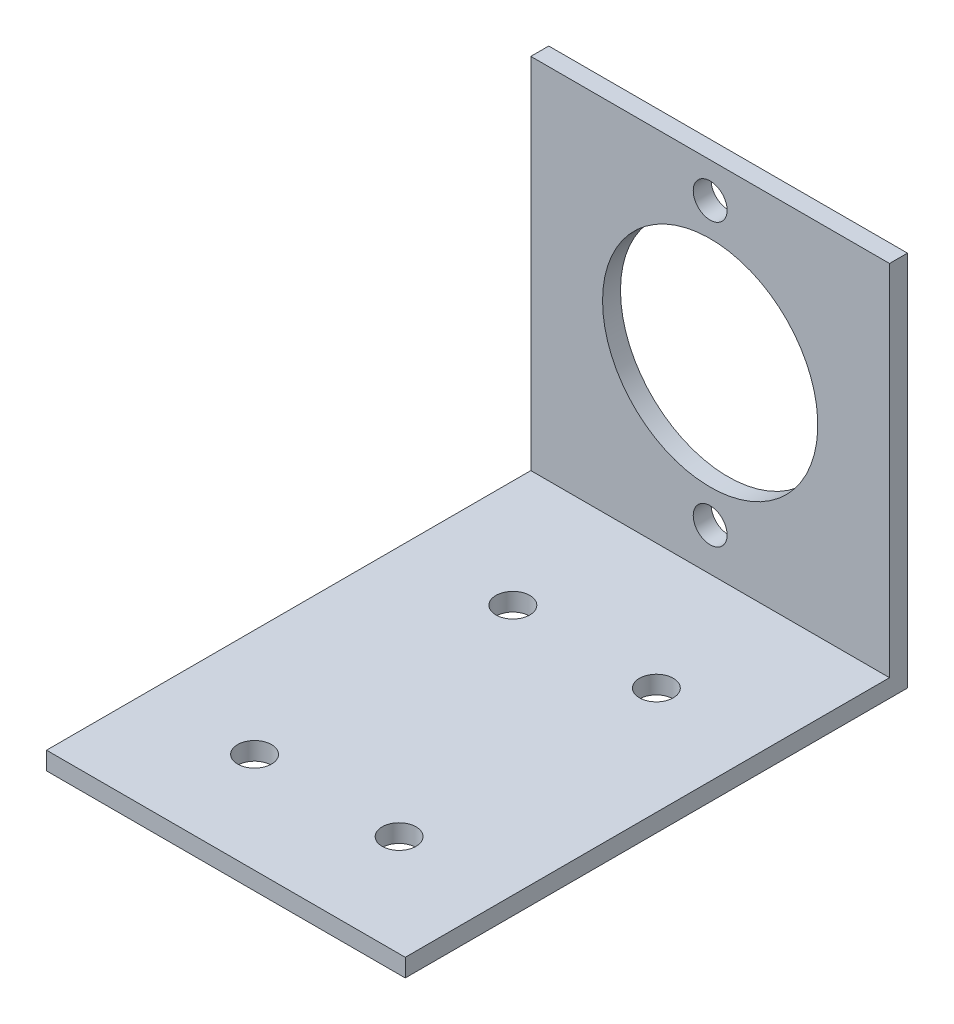
ISO-10303-21;
HEADER;
FILE_DESCRIPTION(('STEP AP214'),'2;1');
FILE_NAME('part.step','',(''),(''),'','','');
FILE_SCHEMA(('AUTOMOTIVE_DESIGN { 1 0 10303 214 1 1 1 1 }'));
ENDSEC;
DATA;
#1=APPLICATION_CONTEXT('core data for automotive mechanical design processes');
#2=APPLICATION_PROTOCOL_DEFINITION('international standard','automotive_design',2000,#1);
#3=PRODUCT_CONTEXT('',#1,'mechanical');
#4=PRODUCT('Part','Part','',(#3));
#5=PRODUCT_RELATED_PRODUCT_CATEGORY('part','',(#4));
#6=PRODUCT_DEFINITION_FORMATION('','',#4);
#7=PRODUCT_DEFINITION_CONTEXT('part definition',#1,'design');
#8=PRODUCT_DEFINITION('design','',#6,#7);
#9=PRODUCT_DEFINITION_SHAPE('','',#8);
#10=(LENGTH_UNIT() NAMED_UNIT(*) SI_UNIT(.MILLI.,.METRE.));
#11=(NAMED_UNIT(*) PLANE_ANGLE_UNIT() SI_UNIT($,.RADIAN.));
#12=(NAMED_UNIT(*) SI_UNIT($,.STERADIAN.) SOLID_ANGLE_UNIT());
#13=UNCERTAINTY_MEASURE_WITH_UNIT(LENGTH_MEASURE(1.E-05),#10,'distance_accuracy_value','');
#14=(GEOMETRIC_REPRESENTATION_CONTEXT(3) GLOBAL_UNCERTAINTY_ASSIGNED_CONTEXT((#13)) GLOBAL_UNIT_ASSIGNED_CONTEXT((#10,
#11,#12)) REPRESENTATION_CONTEXT('',''));
#15=CARTESIAN_POINT('',(0.,0.,0.));
#16=DIRECTION('',(0.,0.,1.));
#17=DIRECTION('',(1.,0.,0.));
#18=AXIS2_PLACEMENT_3D('',#15,#16,#17);
#19=CARTESIAN_POINT('',(0.,1.5875,44.45));
#20=DIRECTION('',(0.,-1.,0.));
#21=DIRECTION('',(0.,0.,-1.));
#22=AXIS2_PLACEMENT_3D('',#19,#20,#21);
#23=PLANE('',#22);
#24=CARTESIAN_POINT('',(22.225,1.5875,12.7));
#25=DIRECTION('',(0.,1.,0.));
#26=DIRECTION('',(0.,0.,1.));
#27=AXIS2_PLACEMENT_3D('',#24,#25,#26);
#28=CIRCLE('',#27,1.49999999999999);
#29=CARTESIAN_POINT('',(22.225,1.5875,14.2));
#30=VERTEX_POINT('',#29);
#31=EDGE_CURVE('E193',#30,#30,#28,.T.);
#32=ORIENTED_EDGE('',*,*,#31,.F.);
#33=EDGE_LOOP('',(#32));
#34=FACE_BOUND('',#33,.T.);
#35=CARTESIAN_POINT('',(22.225,1.5875,35.4699303706849));
#36=DIRECTION('',(0.,1.,0.));
#37=DIRECTION('',(0.,0.,1.));
#38=AXIS2_PLACEMENT_3D('',#35,#36,#37);
#39=CIRCLE('',#38,1.49999999999999);
#40=CARTESIAN_POINT('',(22.225,1.5875,36.9699303706849));
#41=VERTEX_POINT('',#40);
#42=EDGE_CURVE('E180',#41,#41,#39,.T.);
#43=ORIENTED_EDGE('',*,*,#42,.F.);
#44=EDGE_LOOP('',(#43));
#45=FACE_BOUND('',#44,.T.);
#46=CARTESIAN_POINT('',(9.525,1.5875,12.7));
#47=DIRECTION('',(0.,1.,0.));
#48=DIRECTION('',(0.,0.,1.));
#49=AXIS2_PLACEMENT_3D('',#46,#47,#48);
#50=CIRCLE('',#49,1.49999999999999);
#51=CARTESIAN_POINT('',(9.525,1.5875,14.2));
#52=VERTEX_POINT('',#51);
#53=EDGE_CURVE('E176',#52,#52,#50,.T.);
#54=ORIENTED_EDGE('',*,*,#53,.F.);
#55=EDGE_LOOP('',(#54));
#56=FACE_BOUND('',#55,.T.);
#57=CARTESIAN_POINT('',(9.525,1.5875,35.56));
#58=DIRECTION('',(0.,1.,0.));
#59=DIRECTION('',(0.,0.,1.));
#60=AXIS2_PLACEMENT_3D('',#57,#58,#59);
#61=CIRCLE('',#60,1.49999999999999);
#62=CARTESIAN_POINT('',(9.525,1.5875,37.06));
#63=VERTEX_POINT('',#62);
#64=EDGE_CURVE('E175',#63,#63,#61,.T.);
#65=ORIENTED_EDGE('',*,*,#64,.F.);
#66=EDGE_LOOP('',(#65));
#67=FACE_BOUND('',#66,.T.);
#68=DIRECTION('',(1.,0.,0.));
#69=VECTOR('',#68,1.);
#70=CARTESIAN_POINT('',(0.,1.5875,1.5875));
#71=LINE('',#70,#69);
#72=CARTESIAN_POINT('',(0.,1.5875,1.5875));
#73=VERTEX_POINT('',#72);
#74=CARTESIAN_POINT('',(31.75,1.5875,1.5875));
#75=VERTEX_POINT('',#74);
#76=EDGE_CURVE('E57',#73,#75,#71,.T.);
#77=ORIENTED_EDGE('',*,*,#76,.F.);
#78=DIRECTION('',(0.,0.,-1.));
#79=VECTOR('',#78,1.);
#80=CARTESIAN_POINT('',(0.,1.5875,44.45));
#81=LINE('',#80,#79);
#82=CARTESIAN_POINT('',(0.,1.5875,44.45));
#83=VERTEX_POINT('',#82);
#84=EDGE_CURVE('E125',#83,#73,#81,.T.);
#85=ORIENTED_EDGE('',*,*,#84,.F.);
#86=DIRECTION('',(-1.,0.,0.));
#87=VECTOR('',#86,1.);
#88=CARTESIAN_POINT('',(0.,1.5875,44.45));
#89=LINE('',#88,#87);
#90=CARTESIAN_POINT('',(31.75,1.5875,44.45));
#91=VERTEX_POINT('',#90);
#92=EDGE_CURVE('E66',#91,#83,#89,.T.);
#93=ORIENTED_EDGE('',*,*,#92,.F.);
#94=DIRECTION('',(0.,0.,-1.));
#95=VECTOR('',#94,1.);
#96=CARTESIAN_POINT('',(31.75,1.5875,44.45));
#97=LINE('',#96,#95);
#98=EDGE_CURVE('E152',#91,#75,#97,.T.);
#99=ORIENTED_EDGE('',*,*,#98,.T.);
#100=EDGE_LOOP('',(#77,#85,#93,#99));
#101=FACE_BOUND('',#100,.T.);
#102=ADVANCED_FACE('F39',(#34,#45,#56,#67,#101),#23,.F.);
#103=CARTESIAN_POINT('',(0.,0.,44.45));
#104=DIRECTION('',(1.,0.,0.));
#105=DIRECTION('',(0.,0.,-1.));
#106=AXIS2_PLACEMENT_3D('',#103,#104,#105);
#107=PLANE('',#106);
#108=DIRECTION('',(0.,-1.,0.));
#109=VECTOR('',#108,1.);
#110=CARTESIAN_POINT('',(0.,0.,0.));
#111=LINE('',#110,#109);
#112=CARTESIAN_POINT('',(0.,33.3375,0.));
#113=VERTEX_POINT('',#112);
#114=CARTESIAN_POINT('',(0.,0.,0.));
#115=VERTEX_POINT('',#114);
#116=EDGE_CURVE('E127',#113,#115,#111,.T.);
#117=ORIENTED_EDGE('',*,*,#116,.T.);
#118=DIRECTION('',(0.,0.,-1.));
#119=VECTOR('',#118,1.);
#120=CARTESIAN_POINT('',(0.,0.,44.45));
#121=LINE('',#120,#119);
#122=CARTESIAN_POINT('',(0.,0.,44.45));
#123=VERTEX_POINT('',#122);
#124=EDGE_CURVE('E11',#123,#115,#121,.T.);
#125=ORIENTED_EDGE('',*,*,#124,.F.);
#126=DIRECTION('',(0.,-1.,0.));
#127=VECTOR('',#126,1.);
#128=CARTESIAN_POINT('',(0.,0.,44.45));
#129=LINE('',#128,#127);
#130=EDGE_CURVE('E135',#83,#123,#129,.T.);
#131=ORIENTED_EDGE('',*,*,#130,.F.);
#132=ORIENTED_EDGE('',*,*,#84,.T.);
#133=DIRECTION('',(0.,-1.,0.));
#134=VECTOR('',#133,1.);
#135=CARTESIAN_POINT('',(0.,33.3375,1.5875));
#136=LINE('',#135,#134);
#137=CARTESIAN_POINT('',(0.,33.3375,1.5875));
#138=VERTEX_POINT('',#137);
#139=EDGE_CURVE('E105',#138,#73,#136,.T.);
#140=ORIENTED_EDGE('',*,*,#139,.F.);
#141=DIRECTION('',(0.,0.,1.));
#142=VECTOR('',#141,1.);
#143=CARTESIAN_POINT('',(0.,33.3375,0.));
#144=LINE('',#143,#142);
#145=EDGE_CURVE('E113',#113,#138,#144,.T.);
#146=ORIENTED_EDGE('',*,*,#145,.F.);
#147=EDGE_LOOP('',(#117,#125,#131,#132,#140,#146));
#148=FACE_BOUND('',#147,.T.);
#149=ADVANCED_FACE('F41',(#148),#107,.F.);
#150=CARTESIAN_POINT('',(0.,0.,44.45));
#151=DIRECTION('',(0.,1.,0.));
#152=DIRECTION('',(0.,0.,1.));
#153=AXIS2_PLACEMENT_3D('',#150,#151,#152);
#154=PLANE('',#153);
#155=CARTESIAN_POINT('',(22.225,0.,12.7));
#156=DIRECTION('',(0.,1.,0.));
#157=DIRECTION('',(0.,0.,1.));
#158=AXIS2_PLACEMENT_3D('',#155,#156,#157);
#159=CIRCLE('',#158,1.49999999999999);
#160=CARTESIAN_POINT('',(22.225,0.,14.2));
#161=VERTEX_POINT('',#160);
#162=EDGE_CURVE('E43',#161,#161,#159,.T.);
#163=ORIENTED_EDGE('',*,*,#162,.T.);
#164=EDGE_LOOP('',(#163));
#165=FACE_BOUND('',#164,.T.);
#166=CARTESIAN_POINT('',(22.225,0.,35.4699303706849));
#167=DIRECTION('',(0.,1.,0.));
#168=DIRECTION('',(0.,0.,1.));
#169=AXIS2_PLACEMENT_3D('',#166,#167,#168);
#170=CIRCLE('',#169,1.49999999999999);
#171=CARTESIAN_POINT('',(22.225,0.,36.9699303706849));
#172=VERTEX_POINT('',#171);
#173=EDGE_CURVE('E177',#172,#172,#170,.T.);
#174=ORIENTED_EDGE('',*,*,#173,.T.);
#175=EDGE_LOOP('',(#174));
#176=FACE_BOUND('',#175,.T.);
#177=CARTESIAN_POINT('',(9.525,0.,12.7));
#178=DIRECTION('',(0.,1.,0.));
#179=DIRECTION('',(0.,0.,1.));
#180=AXIS2_PLACEMENT_3D('',#177,#178,#179);
#181=CIRCLE('',#180,1.49999999999999);
#182=CARTESIAN_POINT('',(9.525,0.,14.2));
#183=VERTEX_POINT('',#182);
#184=EDGE_CURVE('E172',#183,#183,#181,.T.);
#185=ORIENTED_EDGE('',*,*,#184,.T.);
#186=EDGE_LOOP('',(#185));
#187=FACE_BOUND('',#186,.T.);
#188=CARTESIAN_POINT('',(9.525,0.,35.56));
#189=DIRECTION('',(0.,1.,0.));
#190=DIRECTION('',(0.,0.,1.));
#191=AXIS2_PLACEMENT_3D('',#188,#189,#190);
#192=CIRCLE('',#191,1.49999999999999);
#193=CARTESIAN_POINT('',(9.525,0.,37.06));
#194=VERTEX_POINT('',#193);
#195=EDGE_CURVE('E199',#194,#194,#192,.T.);
#196=ORIENTED_EDGE('',*,*,#195,.T.);
#197=EDGE_LOOP('',(#196));
#198=FACE_BOUND('',#197,.T.);
#199=DIRECTION('',(1.,0.,0.));
#200=VECTOR('',#199,1.);
#201=CARTESIAN_POINT('',(0.,0.,0.));
#202=LINE('',#201,#200);
#203=CARTESIAN_POINT('',(31.75,0.,0.));
#204=VERTEX_POINT('',#203);
#205=EDGE_CURVE('E79',#115,#204,#202,.T.);
#206=ORIENTED_EDGE('',*,*,#205,.T.);
#207=DIRECTION('',(0.,0.,-1.));
#208=VECTOR('',#207,1.);
#209=CARTESIAN_POINT('',(31.75,0.,44.45));
#210=LINE('',#209,#208);
#211=CARTESIAN_POINT('',(31.75,0.,44.45));
#212=VERTEX_POINT('',#211);
#213=EDGE_CURVE('E49',#212,#204,#210,.T.);
#214=ORIENTED_EDGE('',*,*,#213,.F.);
#215=DIRECTION('',(1.,0.,0.));
#216=VECTOR('',#215,1.);
#217=CARTESIAN_POINT('',(0.,0.,44.45));
#218=LINE('',#217,#216);
#219=EDGE_CURVE('E84',#123,#212,#218,.T.);
#220=ORIENTED_EDGE('',*,*,#219,.F.);
#221=ORIENTED_EDGE('',*,*,#124,.T.);
#222=EDGE_LOOP('',(#206,#214,#220,#221));
#223=FACE_BOUND('',#222,.T.);
#224=ADVANCED_FACE('F224',(#165,#176,#187,#198,#223),#154,.F.);
#225=CARTESIAN_POINT('',(31.75,0.,44.45));
#226=DIRECTION('',(-1.,0.,0.));
#227=DIRECTION('',(0.,0.,1.));
#228=AXIS2_PLACEMENT_3D('',#225,#226,#227);
#229=PLANE('',#228);
#230=DIRECTION('',(0.,1.,0.));
#231=VECTOR('',#230,1.);
#232=CARTESIAN_POINT('',(31.75,0.,0.));
#233=LINE('',#232,#231);
#234=CARTESIAN_POINT('',(31.75,33.3375,0.));
#235=VERTEX_POINT('',#234);
#236=EDGE_CURVE('E138',#204,#235,#233,.T.);
#237=ORIENTED_EDGE('',*,*,#236,.T.);
#238=DIRECTION('',(0.,0.,-1.));
#239=VECTOR('',#238,1.);
#240=CARTESIAN_POINT('',(31.75,33.3375,0.));
#241=LINE('',#240,#239);
#242=CARTESIAN_POINT('',(31.75,33.3375,1.5875));
#243=VERTEX_POINT('',#242);
#244=EDGE_CURVE('E112',#243,#235,#241,.T.);
#245=ORIENTED_EDGE('',*,*,#244,.F.);
#246=DIRECTION('',(0.,-1.,0.));
#247=VECTOR('',#246,1.);
#248=CARTESIAN_POINT('',(31.75,33.3375,1.5875));
#249=LINE('',#248,#247);
#250=EDGE_CURVE('E107',#243,#75,#249,.T.);
#251=ORIENTED_EDGE('',*,*,#250,.T.);
#252=ORIENTED_EDGE('',*,*,#98,.F.);
#253=DIRECTION('',(0.,1.,0.));
#254=VECTOR('',#253,1.);
#255=CARTESIAN_POINT('',(31.75,0.,44.45));
#256=LINE('',#255,#254);
#257=EDGE_CURVE('E141',#212,#91,#256,.T.);
#258=ORIENTED_EDGE('',*,*,#257,.F.);
#259=ORIENTED_EDGE('',*,*,#213,.T.);
#260=EDGE_LOOP('',(#237,#245,#251,#252,#258,#259));
#261=FACE_BOUND('',#260,.T.);
#262=ADVANCED_FACE('F218',(#261),#229,.F.);
#263=CARTESIAN_POINT('',(0.,0.,44.45));
#264=DIRECTION('',(0.,0.,-1.));
#265=DIRECTION('',(-1.,0.,0.));
#266=AXIS2_PLACEMENT_3D('',#263,#264,#265);
#267=PLANE('',#266);
#268=ORIENTED_EDGE('',*,*,#130,.T.);
#269=ORIENTED_EDGE('',*,*,#219,.T.);
#270=ORIENTED_EDGE('',*,*,#257,.T.);
#271=ORIENTED_EDGE('',*,*,#92,.T.);
#272=EDGE_LOOP('',(#268,#269,#270,#271));
#273=FACE_BOUND('',#272,.T.);
#274=ADVANCED_FACE('F231',(#273),#267,.F.);
#275=CARTESIAN_POINT('',(0.,0.,0.));
#276=DIRECTION('',(0.,0.,-1.));
#277=DIRECTION('',(-1.,0.,0.));
#278=AXIS2_PLACEMENT_3D('',#275,#276,#277);
#279=PLANE('',#278);
#280=CARTESIAN_POINT('',(15.875,30.226,0.));
#281=DIRECTION('',(0.,0.,-1.));
#282=DIRECTION('',(-1.,0.,0.));
#283=AXIS2_PLACEMENT_3D('',#280,#281,#282);
#284=CIRCLE('',#283,1.5);
#285=CARTESIAN_POINT('',(14.375,30.226,0.));
#286=VERTEX_POINT('',#285);
#287=EDGE_CURVE('E171',#286,#286,#284,.T.);
#288=ORIENTED_EDGE('',*,*,#287,.F.);
#289=EDGE_LOOP('',(#288));
#290=FACE_BOUND('',#289,.T.);
#291=CARTESIAN_POINT('',(15.875,5.334,0.));
#292=DIRECTION('',(0.,0.,-1.));
#293=DIRECTION('',(-1.,0.,0.));
#294=AXIS2_PLACEMENT_3D('',#291,#292,#293);
#295=CIRCLE('',#294,1.5);
#296=CARTESIAN_POINT('',(14.375,5.334,0.));
#297=VERTEX_POINT('',#296);
#298=EDGE_CURVE('E166',#297,#297,#295,.T.);
#299=ORIENTED_EDGE('',*,*,#298,.F.);
#300=EDGE_LOOP('',(#299));
#301=FACE_BOUND('',#300,.T.);
#302=CARTESIAN_POINT('',(15.875,17.78,0.));
#303=DIRECTION('',(0.,0.,-1.));
#304=DIRECTION('',(-1.,0.,0.));
#305=AXIS2_PLACEMENT_3D('',#302,#303,#304);
#306=CIRCLE('',#305,9.525);
#307=CARTESIAN_POINT('',(6.35,17.78,0.));
#308=VERTEX_POINT('',#307);
#309=EDGE_CURVE('E161',#308,#308,#306,.T.);
#310=ORIENTED_EDGE('',*,*,#309,.F.);
#311=EDGE_LOOP('',(#310));
#312=FACE_BOUND('',#311,.T.);
#313=ORIENTED_EDGE('',*,*,#116,.F.);
#314=DIRECTION('',(-1.,0.,0.));
#315=VECTOR('',#314,1.);
#316=CARTESIAN_POINT('',(0.,33.3375,0.));
#317=LINE('',#316,#315);
#318=EDGE_CURVE('E119',#235,#113,#317,.T.);
#319=ORIENTED_EDGE('',*,*,#318,.F.);
#320=ORIENTED_EDGE('',*,*,#236,.F.);
#321=ORIENTED_EDGE('',*,*,#205,.F.);
#322=EDGE_LOOP('',(#313,#319,#320,#321));
#323=FACE_BOUND('',#322,.T.);
#324=ADVANCED_FACE('F222',(#290,#301,#312,#323),#279,.T.);
#325=CARTESIAN_POINT('',(0.,33.3375,1.5875));
#326=DIRECTION('',(0.,0.,-1.));
#327=DIRECTION('',(-1.,0.,0.));
#328=AXIS2_PLACEMENT_3D('',#325,#326,#327);
#329=PLANE('',#328);
#330=CARTESIAN_POINT('',(15.875,30.226,1.5875));
#331=DIRECTION('',(0.,0.,-1.));
#332=DIRECTION('',(-1.,0.,0.));
#333=AXIS2_PLACEMENT_3D('',#330,#331,#332);
#334=CIRCLE('',#333,1.5);
#335=CARTESIAN_POINT('',(14.375,30.226,1.5875));
#336=VERTEX_POINT('',#335);
#337=EDGE_CURVE('E167',#336,#336,#334,.T.);
#338=ORIENTED_EDGE('',*,*,#337,.T.);
#339=EDGE_LOOP('',(#338));
#340=FACE_BOUND('',#339,.T.);
#341=CARTESIAN_POINT('',(15.875,5.334,1.5875));
#342=DIRECTION('',(0.,0.,-1.));
#343=DIRECTION('',(-1.,0.,0.));
#344=AXIS2_PLACEMENT_3D('',#341,#342,#343);
#345=CIRCLE('',#344,1.5);
#346=CARTESIAN_POINT('',(14.375,5.334,1.5875));
#347=VERTEX_POINT('',#346);
#348=EDGE_CURVE('E162',#347,#347,#345,.T.);
#349=ORIENTED_EDGE('',*,*,#348,.T.);
#350=EDGE_LOOP('',(#349));
#351=FACE_BOUND('',#350,.T.);
#352=CARTESIAN_POINT('',(15.875,17.78,1.5875));
#353=DIRECTION('',(0.,0.,-1.));
#354=DIRECTION('',(-1.,0.,0.));
#355=AXIS2_PLACEMENT_3D('',#352,#353,#354);
#356=CIRCLE('',#355,9.525);
#357=CARTESIAN_POINT('',(6.35,17.78,1.5875));
#358=VERTEX_POINT('',#357);
#359=EDGE_CURVE('E157',#358,#358,#356,.T.);
#360=ORIENTED_EDGE('',*,*,#359,.T.);
#361=EDGE_LOOP('',(#360));
#362=FACE_BOUND('',#361,.T.);
#363=ORIENTED_EDGE('',*,*,#76,.T.);
#364=ORIENTED_EDGE('',*,*,#250,.F.);
#365=DIRECTION('',(1.,0.,0.));
#366=VECTOR('',#365,1.);
#367=CARTESIAN_POINT('',(0.,33.3375,1.5875));
#368=LINE('',#367,#366);
#369=EDGE_CURVE('E101',#138,#243,#368,.T.);
#370=ORIENTED_EDGE('',*,*,#369,.F.);
#371=ORIENTED_EDGE('',*,*,#139,.T.);
#372=EDGE_LOOP('',(#363,#364,#370,#371));
#373=FACE_BOUND('',#372,.T.);
#374=ADVANCED_FACE('F103',(#340,#351,#362,#373),#329,.F.);
#375=CARTESIAN_POINT('',(0.,33.3375,0.));
#376=DIRECTION('',(0.,1.,0.));
#377=DIRECTION('',(0.,0.,1.));
#378=AXIS2_PLACEMENT_3D('',#375,#376,#377);
#379=PLANE('',#378);
#380=ORIENTED_EDGE('',*,*,#145,.T.);
#381=ORIENTED_EDGE('',*,*,#369,.T.);
#382=ORIENTED_EDGE('',*,*,#244,.T.);
#383=ORIENTED_EDGE('',*,*,#318,.T.);
#384=EDGE_LOOP('',(#380,#381,#382,#383));
#385=FACE_BOUND('',#384,.T.);
#386=ADVANCED_FACE('F117',(#385),#379,.T.);
#387=CARTESIAN_POINT('',(15.875,17.78,44.45));
#388=DIRECTION('',(0.,0.,-1.));
#389=DIRECTION('',(-1.,0.,0.));
#390=AXIS2_PLACEMENT_3D('',#387,#388,#389);
#391=CYLINDRICAL_SURFACE('',#390,9.525);
#392=ORIENTED_EDGE('',*,*,#309,.T.);
#393=EDGE_LOOP('',(#392));
#394=FACE_BOUND('',#393,.T.);
#395=ORIENTED_EDGE('',*,*,#359,.F.);
#396=EDGE_LOOP('',(#395));
#397=FACE_BOUND('',#396,.T.);
#398=ADVANCED_FACE('F251',(#394,#397),#391,.F.);
#399=CARTESIAN_POINT('',(15.875,5.334,0.));
#400=DIRECTION('',(0.,0.,-1.));
#401=DIRECTION('',(-1.,0.,0.));
#402=AXIS2_PLACEMENT_3D('',#399,#400,#401);
#403=CYLINDRICAL_SURFACE('',#402,1.5);
#404=ORIENTED_EDGE('',*,*,#298,.T.);
#405=EDGE_LOOP('',(#404));
#406=FACE_BOUND('',#405,.T.);
#407=ORIENTED_EDGE('',*,*,#348,.F.);
#408=EDGE_LOOP('',(#407));
#409=FACE_BOUND('',#408,.T.);
#410=ADVANCED_FACE('F254',(#406,#409),#403,.F.);
#411=CARTESIAN_POINT('',(15.875,30.226,0.));
#412=DIRECTION('',(0.,0.,-1.));
#413=DIRECTION('',(-1.,0.,0.));
#414=AXIS2_PLACEMENT_3D('',#411,#412,#413);
#415=CYLINDRICAL_SURFACE('',#414,1.5);
#416=ORIENTED_EDGE('',*,*,#287,.T.);
#417=EDGE_LOOP('',(#416));
#418=FACE_BOUND('',#417,.T.);
#419=ORIENTED_EDGE('',*,*,#337,.F.);
#420=EDGE_LOOP('',(#419));
#421=FACE_BOUND('',#420,.T.);
#422=ADVANCED_FACE('F258',(#418,#421),#415,.F.);
#423=CARTESIAN_POINT('',(9.525,1.5875,35.56));
#424=DIRECTION('',(0.,1.,0.));
#425=DIRECTION('',(0.,0.,1.));
#426=AXIS2_PLACEMENT_3D('',#423,#424,#425);
#427=CYLINDRICAL_SURFACE('',#426,1.49999999999999);
#428=ORIENTED_EDGE('',*,*,#64,.T.);
#429=EDGE_LOOP('',(#428));
#430=FACE_BOUND('',#429,.T.);
#431=ORIENTED_EDGE('',*,*,#195,.F.);
#432=EDGE_LOOP('',(#431));
#433=FACE_BOUND('',#432,.T.);
#434=ADVANCED_FACE('F262',(#430,#433),#427,.F.);
#435=CARTESIAN_POINT('',(9.525,1.5875,12.7));
#436=DIRECTION('',(0.,1.,0.));
#437=DIRECTION('',(0.,0.,1.));
#438=AXIS2_PLACEMENT_3D('',#435,#436,#437);
#439=CYLINDRICAL_SURFACE('',#438,1.49999999999999);
#440=ORIENTED_EDGE('',*,*,#53,.T.);
#441=EDGE_LOOP('',(#440));
#442=FACE_BOUND('',#441,.T.);
#443=ORIENTED_EDGE('',*,*,#184,.F.);
#444=EDGE_LOOP('',(#443));
#445=FACE_BOUND('',#444,.T.);
#446=ADVANCED_FACE('F266',(#442,#445),#439,.F.);
#447=CARTESIAN_POINT('',(22.225,1.5875,35.4699303706849));
#448=DIRECTION('',(0.,1.,0.));
#449=DIRECTION('',(0.,0.,1.));
#450=AXIS2_PLACEMENT_3D('',#447,#448,#449);
#451=CYLINDRICAL_SURFACE('',#450,1.49999999999999);
#452=ORIENTED_EDGE('',*,*,#42,.T.);
#453=EDGE_LOOP('',(#452));
#454=FACE_BOUND('',#453,.T.);
#455=ORIENTED_EDGE('',*,*,#173,.F.);
#456=EDGE_LOOP('',(#455));
#457=FACE_BOUND('',#456,.T.);
#458=ADVANCED_FACE('F270',(#454,#457),#451,.F.);
#459=CARTESIAN_POINT('',(22.225,1.5875,12.7));
#460=DIRECTION('',(0.,1.,0.));
#461=DIRECTION('',(0.,0.,1.));
#462=AXIS2_PLACEMENT_3D('',#459,#460,#461);
#463=CYLINDRICAL_SURFACE('',#462,1.49999999999999);
#464=ORIENTED_EDGE('',*,*,#31,.T.);
#465=EDGE_LOOP('',(#464));
#466=FACE_BOUND('',#465,.T.);
#467=ORIENTED_EDGE('',*,*,#162,.F.);
#468=EDGE_LOOP('',(#467));
#469=FACE_BOUND('',#468,.T.);
#470=ADVANCED_FACE('F274',(#466,#469),#463,.F.);
#471=CLOSED_SHELL('',(#102,#149,#224,#262,#274,#324,#374,#386,#398,#410,#422,#434,#446,#458,#470));
#472=MANIFOLD_SOLID_BREP('B2',#471);
#473=ADVANCED_BREP_SHAPE_REPRESENTATION('',(#18,#472),#14);
#474=SHAPE_DEFINITION_REPRESENTATION(#9,#473);
ENDSEC;
END-ISO-10303-21;
